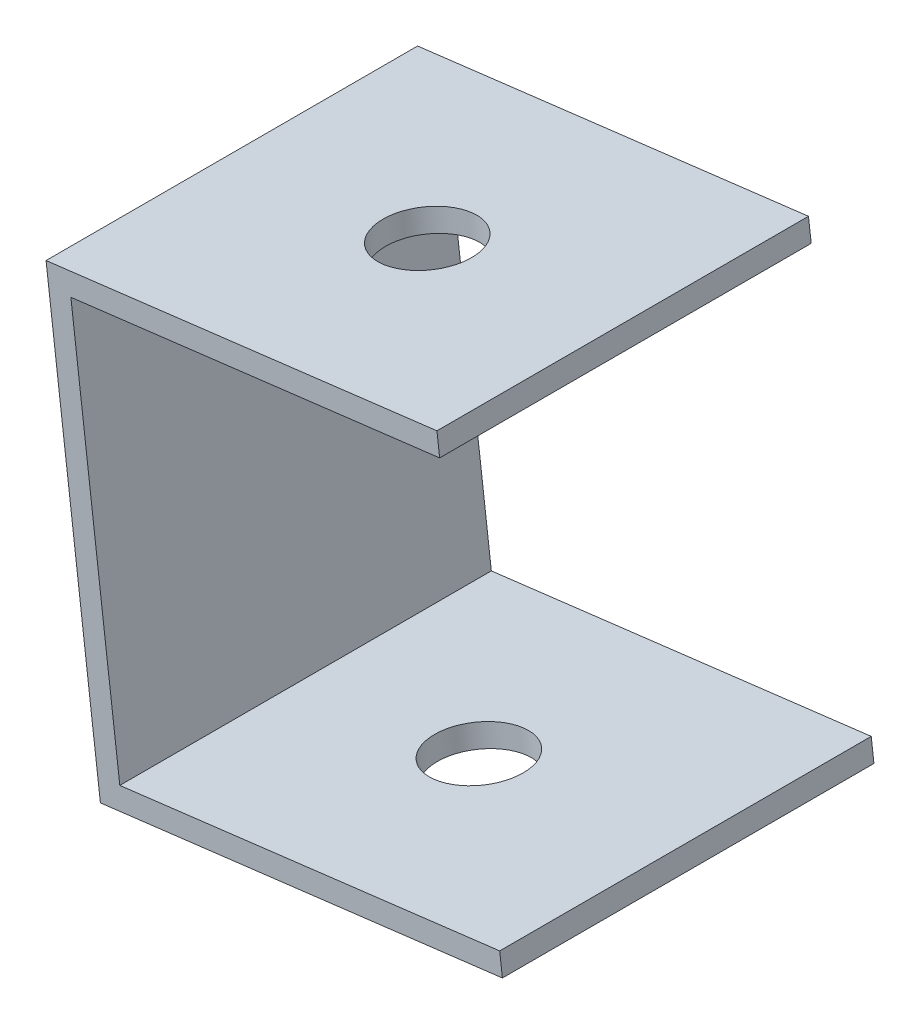
ISO-10303-21;
HEADER;
FILE_DESCRIPTION(('STEP AP214'),'2;1');
FILE_NAME('part.step','',(''),(''),'','','');
FILE_SCHEMA(('AUTOMOTIVE_DESIGN { 1 0 10303 214 1 1 1 1 }'));
ENDSEC;
DATA;
#1=APPLICATION_CONTEXT('core data for automotive mechanical design processes');
#2=APPLICATION_PROTOCOL_DEFINITION('international standard','automotive_design',2000,#1);
#3=PRODUCT_CONTEXT('',#1,'mechanical');
#4=PRODUCT('Part','Part','',(#3));
#5=PRODUCT_RELATED_PRODUCT_CATEGORY('part','',(#4));
#6=PRODUCT_DEFINITION_FORMATION('','',#4);
#7=PRODUCT_DEFINITION_CONTEXT('part definition',#1,'design');
#8=PRODUCT_DEFINITION('design','',#6,#7);
#9=PRODUCT_DEFINITION_SHAPE('','',#8);
#10=(LENGTH_UNIT() NAMED_UNIT(*) SI_UNIT(.MILLI.,.METRE.));
#11=(NAMED_UNIT(*) PLANE_ANGLE_UNIT() SI_UNIT($,.RADIAN.));
#12=(NAMED_UNIT(*) SI_UNIT($,.STERADIAN.) SOLID_ANGLE_UNIT());
#13=UNCERTAINTY_MEASURE_WITH_UNIT(LENGTH_MEASURE(1.E-05),#10,'distance_accuracy_value','');
#14=(GEOMETRIC_REPRESENTATION_CONTEXT(3) GLOBAL_UNCERTAINTY_ASSIGNED_CONTEXT((#13)) GLOBAL_UNIT_ASSIGNED_CONTEXT((#10,
#11,#12)) REPRESENTATION_CONTEXT('',''));
#15=CARTESIAN_POINT('',(0.,0.,0.));
#16=DIRECTION('',(0.,0.,1.));
#17=DIRECTION('',(1.,0.,0.));
#18=AXIS2_PLACEMENT_3D('',#15,#16,#17);
#19=CARTESIAN_POINT('',(54.1021961274049,6.64291439538608,50.));
#20=DIRECTION('',(-0.121869343405145,0.992546151641323,0.));
#21=DIRECTION('',(-0.992546151641323,-0.121869343405145,0.));
#22=AXIS2_PLACEMENT_3D('',#19,#20,#21);
#23=PLANE('',#22);
#24=CARTESIAN_POINT('',(26.3024730184951,3.22953760023633,25.));
#25=DIRECTION('',(-0.121869343405145,0.992546151641323,0.));
#26=DIRECTION('',(-0.992546151641323,-0.121869343405145,0.));
#27=AXIS2_PLACEMENT_3D('',#24,#25,#26);
#28=CIRCLE('',#27,6.00000000000001);
#29=CARTESIAN_POINT('',(20.3471961086471,2.49832153980547,25.));
#30=VERTEX_POINT('',#29);
#31=EDGE_CURVE('E191',#30,#30,#28,.F.);
#32=ORIENTED_EDGE('',*,*,#31,.F.);
#33=EDGE_LOOP('',(#32));
#34=FACE_BOUND('',#33,.T.);
#35=DIRECTION('',(0.992546151641322,0.121869343405145,0.));
#36=VECTOR('',#35,1.);
#37=CARTESIAN_POINT('',(54.1021961274049,6.64291439538608,0.));
#38=LINE('',#37,#36);
#39=CARTESIAN_POINT('',(0.,0.,0.));
#40=VERTEX_POINT('',#39);
#41=CARTESIAN_POINT('',(54.1021961274049,6.64291439538608,0.));
#42=VERTEX_POINT('',#41);
#43=EDGE_CURVE('E138',#40,#42,#38,.T.);
#44=ORIENTED_EDGE('',*,*,#43,.T.);
#45=DIRECTION('',(0.,0.,-1.));
#46=VECTOR('',#45,1.);
#47=CARTESIAN_POINT('',(54.1021961274049,6.64291439538608,50.));
#48=LINE('',#47,#46);
#49=CARTESIAN_POINT('',(54.1021961274049,6.64291439538608,50.));
#50=VERTEX_POINT('',#49);
#51=EDGE_CURVE('E11',#50,#42,#48,.T.);
#52=ORIENTED_EDGE('',*,*,#51,.F.);
#53=DIRECTION('',(0.992546151641322,0.121869343405145,0.));
#54=VECTOR('',#53,1.);
#55=CARTESIAN_POINT('',(54.1021961274049,6.64291439538608,50.));
#56=LINE('',#55,#54);
#57=CARTESIAN_POINT('',(0.,0.,50.));
#58=VERTEX_POINT('',#57);
#59=EDGE_CURVE('E153',#58,#50,#56,.T.);
#60=ORIENTED_EDGE('',*,*,#59,.F.);
#61=DIRECTION('',(0.,0.,-1.));
#62=VECTOR('',#61,1.);
#63=CARTESIAN_POINT('',(0.,0.,50.));
#64=LINE('',#63,#62);
#65=EDGE_CURVE('E134',#58,#40,#64,.T.);
#66=ORIENTED_EDGE('',*,*,#65,.T.);
#67=EDGE_LOOP('',(#44,#52,#60,#66));
#68=FACE_BOUND('',#67,.T.);
#69=ADVANCED_FACE('F42',(#34,#68),#23,.F.);
#70=CARTESIAN_POINT('',(53.7365880971895,9.62055285031005,50.));
#71=DIRECTION('',(-0.992546151641322,-0.121869343405146,0.));
#72=DIRECTION('',(0.121869343405146,-0.992546151641322,0.));
#73=AXIS2_PLACEMENT_3D('',#70,#71,#72);
#74=PLANE('',#73);
#75=DIRECTION('',(-0.121869343405145,0.992546151641322,0.));
#76=VECTOR('',#75,1.);
#77=CARTESIAN_POINT('',(53.7365880971895,9.62055285031005,0.));
#78=LINE('',#77,#76);
#79=CARTESIAN_POINT('',(53.7365880971895,9.62055285031005,0.));
#80=VERTEX_POINT('',#79);
#81=EDGE_CURVE('E141',#42,#80,#78,.T.);
#82=ORIENTED_EDGE('',*,*,#81,.T.);
#83=DIRECTION('',(0.,0.,-1.));
#84=VECTOR('',#83,1.);
#85=CARTESIAN_POINT('',(53.7365880971895,9.62055285031005,50.));
#86=LINE('',#85,#84);
#87=CARTESIAN_POINT('',(53.7365880971895,9.62055285031005,50.));
#88=VERTEX_POINT('',#87);
#89=EDGE_CURVE('E50',#88,#80,#86,.T.);
#90=ORIENTED_EDGE('',*,*,#89,.F.);
#91=DIRECTION('',(-0.121869343405145,0.992546151641322,0.));
#92=VECTOR('',#91,1.);
#93=CARTESIAN_POINT('',(53.7365880971895,9.62055285031005,50.));
#94=LINE('',#93,#92);
#95=EDGE_CURVE('E101',#50,#88,#94,.T.);
#96=ORIENTED_EDGE('',*,*,#95,.F.);
#97=ORIENTED_EDGE('',*,*,#51,.T.);
#98=EDGE_LOOP('',(#82,#90,#96,#97));
#99=FACE_BOUND('',#98,.T.);
#100=ADVANCED_FACE('F213',(#99),#74,.F.);
#101=CARTESIAN_POINT('',(2.61203042470855,3.34324648513938,50.));
#102=DIRECTION('',(0.121869343405145,-0.992546151641322,0.));
#103=DIRECTION('',(0.992546151641322,0.121869343405145,0.));
#104=AXIS2_PLACEMENT_3D('',#101,#102,#103);
#105=PLANE('',#104);
#106=CARTESIAN_POINT('',(25.9368649882796,6.20717605516029,25.));
#107=DIRECTION('',(0.121869343405145,-0.992546151641322,0.));
#108=DIRECTION('',(0.992546151641322,0.121869343405145,0.));
#109=AXIS2_PLACEMENT_3D('',#106,#107,#108);
#110=CIRCLE('',#109,6.00000000000001);
#111=CARTESIAN_POINT('',(31.8921418981276,6.93839211559116,25.));
#112=VERTEX_POINT('',#111);
#113=EDGE_CURVE('E142',#112,#112,#110,.T.);
#114=ORIENTED_EDGE('',*,*,#113,.T.);
#115=EDGE_LOOP('',(#114));
#116=FACE_BOUND('',#115,.T.);
#117=DIRECTION('',(-0.992546151641322,-0.121869343405145,0.));
#118=VECTOR('',#117,1.);
#119=CARTESIAN_POINT('',(2.61203042470855,3.34324648513938,0.));
#120=LINE('',#119,#118);
#121=CARTESIAN_POINT('',(2.61203042470855,3.34324648513938,0.));
#122=VERTEX_POINT('',#121);
#123=EDGE_CURVE('E144',#80,#122,#120,.T.);
#124=ORIENTED_EDGE('',*,*,#123,.T.);
#125=DIRECTION('',(0.,0.,-1.));
#126=VECTOR('',#125,1.);
#127=CARTESIAN_POINT('',(2.61203042470855,3.34324648513938,50.));
#128=LINE('',#127,#126);
#129=CARTESIAN_POINT('',(2.61203042470855,3.34324648513938,50.));
#130=VERTEX_POINT('',#129);
#131=EDGE_CURVE('E160',#130,#122,#128,.T.);
#132=ORIENTED_EDGE('',*,*,#131,.F.);
#133=DIRECTION('',(-0.992546151641322,-0.121869343405145,0.));
#134=VECTOR('',#133,1.);
#135=CARTESIAN_POINT('',(2.61203042470855,3.34324648513938,50.));
#136=LINE('',#135,#134);
#137=EDGE_CURVE('E168',#88,#130,#136,.T.);
#138=ORIENTED_EDGE('',*,*,#137,.F.);
#139=ORIENTED_EDGE('',*,*,#89,.T.);
#140=EDGE_LOOP('',(#124,#132,#138,#139));
#141=FACE_BOUND('',#140,.T.);
#142=ADVANCED_FACE('F166',(#116,#141),#105,.F.);
#143=CARTESIAN_POINT('',(-3.96891411916928,56.9407386737708,50.));
#144=DIRECTION('',(-0.992546151641322,-0.121869343405145,0.));
#145=DIRECTION('',(0.121869343405145,-0.992546151641322,0.));
#146=AXIS2_PLACEMENT_3D('',#143,#144,#145);
#147=PLANE('',#146);
#148=DIRECTION('',(-0.121869343405145,0.992546151641322,0.));
#149=VECTOR('',#148,1.);
#150=CARTESIAN_POINT('',(-3.96891411916928,56.9407386737708,0.));
#151=LINE('',#150,#149);
#152=CARTESIAN_POINT('',(-3.96891411916928,56.9407386737708,0.));
#153=VERTEX_POINT('',#152);
#154=EDGE_CURVE('E146',#122,#153,#151,.T.);
#155=ORIENTED_EDGE('',*,*,#154,.T.);
#156=DIRECTION('',(0.,0.,-1.));
#157=VECTOR('',#156,1.);
#158=CARTESIAN_POINT('',(-3.96891411916928,56.9407386737708,50.));
#159=LINE('',#158,#157);
#160=CARTESIAN_POINT('',(-3.96891411916928,56.9407386737708,50.));
#161=VERTEX_POINT('',#160);
#162=EDGE_CURVE('E157',#161,#153,#159,.T.);
#163=ORIENTED_EDGE('',*,*,#162,.F.);
#164=DIRECTION('',(-0.121869343405145,0.992546151641322,0.));
#165=VECTOR('',#164,1.);
#166=CARTESIAN_POINT('',(-3.96891411916928,56.9407386737708,50.));
#167=LINE('',#166,#165);
#168=EDGE_CURVE('E180',#130,#161,#167,.T.);
#169=ORIENTED_EDGE('',*,*,#168,.F.);
#170=ORIENTED_EDGE('',*,*,#131,.T.);
#171=EDGE_LOOP('',(#155,#163,#169,#170));
#172=FACE_BOUND('',#171,.T.);
#173=ADVANCED_FACE('F176',(#172),#147,.F.);
#174=CARTESIAN_POINT('',(45.6583934628968,63.034205844028,50.));
#175=DIRECTION('',(-0.121869343405145,0.992546151641322,0.));
#176=DIRECTION('',(-0.992546151641322,-0.121869343405145,0.));
#177=AXIS2_PLACEMENT_3D('',#174,#175,#176);
#178=PLANE('',#177);
#179=CARTESIAN_POINT('',(19.3559204444018,59.8046682437917,25.));
#180=DIRECTION('',(-0.121869343405145,0.992546151641322,0.));
#181=DIRECTION('',(-0.992546151641322,-0.121869343405145,0.));
#182=AXIS2_PLACEMENT_3D('',#179,#180,#181);
#183=CIRCLE('',#182,6.00000000000001);
#184=CARTESIAN_POINT('',(13.4006435345539,59.0734521833608,25.));
#185=VERTEX_POINT('',#184);
#186=EDGE_CURVE('E188',#185,#185,#183,.T.);
#187=ORIENTED_EDGE('',*,*,#186,.T.);
#188=EDGE_LOOP('',(#187));
#189=FACE_BOUND('',#188,.T.);
#190=DIRECTION('',(0.992546151641322,0.121869343405145,0.));
#191=VECTOR('',#190,1.);
#192=CARTESIAN_POINT('',(45.6583934628968,63.034205844028,0.));
#193=LINE('',#192,#191);
#194=CARTESIAN_POINT('',(45.6583934628968,63.034205844028,0.));
#195=VERTEX_POINT('',#194);
#196=EDGE_CURVE('E148',#153,#195,#193,.T.);
#197=ORIENTED_EDGE('',*,*,#196,.T.);
#198=DIRECTION('',(0.,0.,-1.));
#199=VECTOR('',#198,1.);
#200=CARTESIAN_POINT('',(45.6583934628968,63.034205844028,50.));
#201=LINE('',#200,#199);
#202=CARTESIAN_POINT('',(45.6583934628968,63.034205844028,50.));
#203=VERTEX_POINT('',#202);
#204=EDGE_CURVE('E129',#203,#195,#201,.T.);
#205=ORIENTED_EDGE('',*,*,#204,.F.);
#206=DIRECTION('',(0.992546151641322,0.121869343405145,0.));
#207=VECTOR('',#206,1.);
#208=CARTESIAN_POINT('',(45.6583934628968,63.034205844028,50.));
#209=LINE('',#208,#207);
#210=EDGE_CURVE('E120',#161,#203,#209,.T.);
#211=ORIENTED_EDGE('',*,*,#210,.F.);
#212=ORIENTED_EDGE('',*,*,#162,.T.);
#213=EDGE_LOOP('',(#197,#205,#211,#212));
#214=FACE_BOUND('',#213,.T.);
#215=ADVANCED_FACE('F179',(#189,#214),#178,.F.);
#216=CARTESIAN_POINT('',(45.2927854326814,66.011844298952,50.));
#217=DIRECTION('',(-0.992546151641322,-0.121869343405144,0.));
#218=DIRECTION('',(0.121869343405144,-0.992546151641322,0.));
#219=AXIS2_PLACEMENT_3D('',#216,#217,#218);
#220=PLANE('',#219);
#221=DIRECTION('',(-0.121869343405144,0.992546151641322,0.));
#222=VECTOR('',#221,1.);
#223=CARTESIAN_POINT('',(45.2927854326814,66.011844298952,0.));
#224=LINE('',#223,#222);
#225=CARTESIAN_POINT('',(45.2927854326814,66.011844298952,0.));
#226=VERTEX_POINT('',#225);
#227=EDGE_CURVE('E128',#195,#226,#224,.T.);
#228=ORIENTED_EDGE('',*,*,#227,.T.);
#229=DIRECTION('',(0.,0.,-1.));
#230=VECTOR('',#229,1.);
#231=CARTESIAN_POINT('',(45.2927854326814,66.011844298952,50.));
#232=LINE('',#231,#230);
#233=CARTESIAN_POINT('',(45.2927854326814,66.011844298952,50.));
#234=VERTEX_POINT('',#233);
#235=EDGE_CURVE('E125',#234,#226,#232,.T.);
#236=ORIENTED_EDGE('',*,*,#235,.F.);
#237=DIRECTION('',(-0.121869343405144,0.992546151641322,0.));
#238=VECTOR('',#237,1.);
#239=CARTESIAN_POINT('',(45.2927854326814,66.011844298952,50.));
#240=LINE('',#239,#238);
#241=EDGE_CURVE('E114',#203,#234,#240,.T.);
#242=ORIENTED_EDGE('',*,*,#241,.F.);
#243=ORIENTED_EDGE('',*,*,#204,.T.);
#244=EDGE_LOOP('',(#228,#236,#242,#243));
#245=FACE_BOUND('',#244,.T.);
#246=ADVANCED_FACE('F126',(#245),#220,.F.);
#247=CARTESIAN_POINT('',(-7.31216060430867,59.5527690984793,50.));
#248=DIRECTION('',(0.121869343405145,-0.992546151641322,0.));
#249=DIRECTION('',(0.992546151641322,0.121869343405145,0.));
#250=AXIS2_PLACEMENT_3D('',#247,#248,#249);
#251=PLANE('',#250);
#252=CARTESIAN_POINT('',(18.9903124141864,62.7823066987156,25.));
#253=DIRECTION('',(-0.121869343405145,0.992546151641322,0.));
#254=DIRECTION('',(-0.992546151641322,-0.121869343405145,0.));
#255=AXIS2_PLACEMENT_3D('',#252,#253,#254);
#256=CIRCLE('',#255,6.00000000000001);
#257=CARTESIAN_POINT('',(13.0350355043384,62.0510906382848,25.));
#258=VERTEX_POINT('',#257);
#259=EDGE_CURVE('E194',#258,#258,#256,.T.);
#260=ORIENTED_EDGE('',*,*,#259,.F.);
#261=EDGE_LOOP('',(#260));
#262=FACE_BOUND('',#261,.T.);
#263=DIRECTION('',(-0.992546151641322,-0.121869343405145,0.));
#264=VECTOR('',#263,1.);
#265=CARTESIAN_POINT('',(-7.31216060430867,59.5527690984793,0.));
#266=LINE('',#265,#264);
#267=CARTESIAN_POINT('',(-7.31216060430867,59.5527690984793,0.));
#268=VERTEX_POINT('',#267);
#269=EDGE_CURVE('E87',#226,#268,#266,.T.);
#270=ORIENTED_EDGE('',*,*,#269,.T.);
#271=DIRECTION('',(0.,0.,-1.));
#272=VECTOR('',#271,1.);
#273=CARTESIAN_POINT('',(-7.31216060430867,59.5527690984793,50.));
#274=LINE('',#273,#272);
#275=CARTESIAN_POINT('',(-7.31216060430867,59.5527690984793,50.));
#276=VERTEX_POINT('',#275);
#277=EDGE_CURVE('E130',#276,#268,#274,.T.);
#278=ORIENTED_EDGE('',*,*,#277,.F.);
#279=DIRECTION('',(-0.992546151641322,-0.121869343405145,0.));
#280=VECTOR('',#279,1.);
#281=CARTESIAN_POINT('',(-7.31216060430867,59.5527690984793,50.));
#282=LINE('',#281,#280);
#283=EDGE_CURVE('E118',#234,#276,#282,.T.);
#284=ORIENTED_EDGE('',*,*,#283,.F.);
#285=ORIENTED_EDGE('',*,*,#235,.T.);
#286=EDGE_LOOP('',(#270,#278,#284,#285));
#287=FACE_BOUND('',#286,.T.);
#288=ADVANCED_FACE('F132',(#262,#287),#251,.F.);
#289=CARTESIAN_POINT('',(0.,0.,50.));
#290=DIRECTION('',(0.992546151641323,0.121869343405145,0.));
#291=DIRECTION('',(-0.121869343405145,0.992546151641323,0.));
#292=AXIS2_PLACEMENT_3D('',#289,#290,#291);
#293=PLANE('',#292);
#294=DIRECTION('',(0.121869343405145,-0.992546151641322,0.));
#295=VECTOR('',#294,1.);
#296=CARTESIAN_POINT('',(0.,0.,0.));
#297=LINE('',#296,#295);
#298=EDGE_CURVE('E93',#268,#40,#297,.T.);
#299=ORIENTED_EDGE('',*,*,#298,.T.);
#300=ORIENTED_EDGE('',*,*,#65,.F.);
#301=DIRECTION('',(0.121869343405145,-0.992546151641322,0.));
#302=VECTOR('',#301,1.);
#303=CARTESIAN_POINT('',(0.,0.,50.));
#304=LINE('',#303,#302);
#305=EDGE_CURVE('E58',#276,#58,#304,.T.);
#306=ORIENTED_EDGE('',*,*,#305,.F.);
#307=ORIENTED_EDGE('',*,*,#277,.T.);
#308=EDGE_LOOP('',(#299,#300,#306,#307));
#309=FACE_BOUND('',#308,.T.);
#310=ADVANCED_FACE('F202',(#309),#293,.F.);
#311=CARTESIAN_POINT('',(0.,0.,50.));
#312=DIRECTION('',(0.,0.,-1.));
#313=DIRECTION('',(-1.,0.,0.));
#314=AXIS2_PLACEMENT_3D('',#311,#312,#313);
#315=PLANE('',#314);
#316=ORIENTED_EDGE('',*,*,#59,.T.);
#317=ORIENTED_EDGE('',*,*,#95,.T.);
#318=ORIENTED_EDGE('',*,*,#137,.T.);
#319=ORIENTED_EDGE('',*,*,#168,.T.);
#320=ORIENTED_EDGE('',*,*,#210,.T.);
#321=ORIENTED_EDGE('',*,*,#241,.T.);
#322=ORIENTED_EDGE('',*,*,#283,.T.);
#323=ORIENTED_EDGE('',*,*,#305,.T.);
#324=EDGE_LOOP('',(#316,#317,#318,#319,#320,#321,#322,#323));
#325=FACE_BOUND('',#324,.T.);
#326=ADVANCED_FACE('F116',(#325),#315,.F.);
#327=CARTESIAN_POINT('',(0.,0.,0.));
#328=DIRECTION('',(0.,0.,-1.));
#329=DIRECTION('',(-1.,0.,0.));
#330=AXIS2_PLACEMENT_3D('',#327,#328,#329);
#331=PLANE('',#330);
#332=ORIENTED_EDGE('',*,*,#43,.F.);
#333=ORIENTED_EDGE('',*,*,#298,.F.);
#334=ORIENTED_EDGE('',*,*,#269,.F.);
#335=ORIENTED_EDGE('',*,*,#227,.F.);
#336=ORIENTED_EDGE('',*,*,#196,.F.);
#337=ORIENTED_EDGE('',*,*,#154,.F.);
#338=ORIENTED_EDGE('',*,*,#123,.F.);
#339=ORIENTED_EDGE('',*,*,#81,.F.);
#340=EDGE_LOOP('',(#332,#333,#334,#335,#336,#337,#338,#339));
#341=FACE_BOUND('',#340,.T.);
#342=ADVANCED_FACE('F172',(#341),#331,.T.);
#343=CARTESIAN_POINT('',(28.3706643578678,-13.6145291469523,25.));
#344=DIRECTION('',(-0.121869343405145,0.992546151641322,0.));
#345=DIRECTION('',(-0.992546151641322,-0.121869343405145,0.));
#346=AXIS2_PLACEMENT_3D('',#343,#344,#345);
#347=CYLINDRICAL_SURFACE('',#346,6.00000000000001);
#348=ORIENTED_EDGE('',*,*,#259,.T.);
#349=EDGE_LOOP('',(#348));
#350=FACE_BOUND('',#349,.T.);
#351=ORIENTED_EDGE('',*,*,#186,.F.);
#352=EDGE_LOOP('',(#351));
#353=FACE_BOUND('',#352,.T.);
#354=ADVANCED_FACE('F198',(#350,#353),#347,.F.);
#355=ORIENTED_EDGE('',*,*,#31,.T.);
#356=EDGE_LOOP('',(#355));
#357=FACE_BOUND('',#356,.T.);
#358=ORIENTED_EDGE('',*,*,#113,.F.);
#359=EDGE_LOOP('',(#358));
#360=FACE_BOUND('',#359,.T.);
#361=ADVANCED_FACE('F225',(#357,#360),#347,.F.);
#362=CLOSED_SHELL('',(#69,#100,#142,#173,#215,#246,#288,#310,#326,#342,#354,#361));
#363=MANIFOLD_SOLID_BREP('B2',#362);
#364=ADVANCED_BREP_SHAPE_REPRESENTATION('',(#18,#363),#14);
#365=SHAPE_DEFINITION_REPRESENTATION(#9,#364);
ENDSEC;
END-ISO-10303-21;
